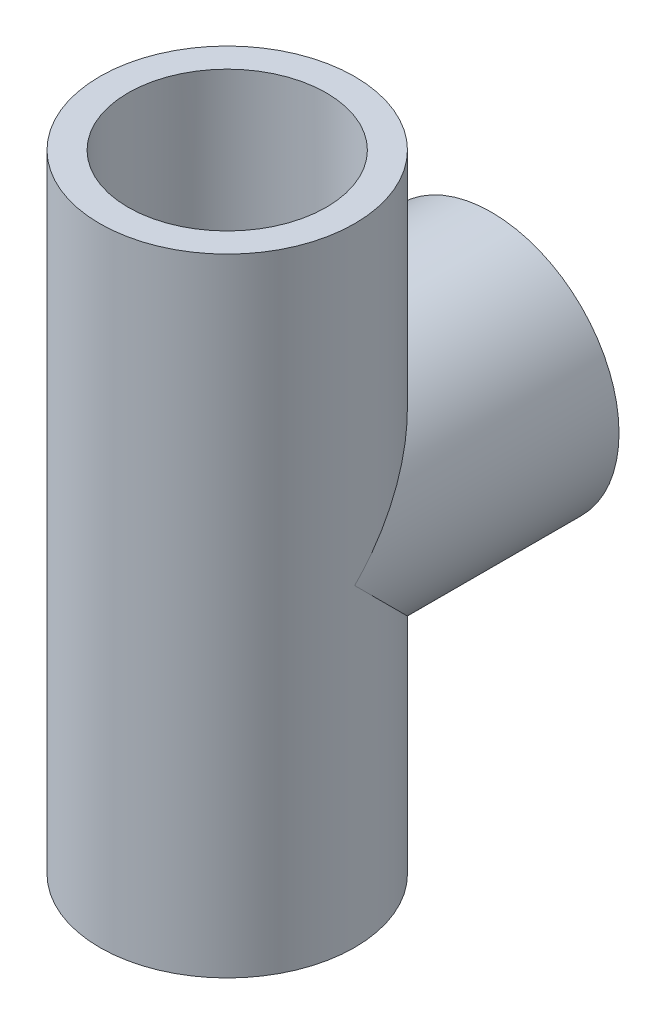
ISO-10303-21;
HEADER;
FILE_DESCRIPTION(('STEP AP214'),'2;1');
FILE_NAME('part.step','',(''),(''),'','','');
FILE_SCHEMA(('AUTOMOTIVE_DESIGN { 1 0 10303 214 1 1 1 1 }'));
ENDSEC;
DATA;
#1=APPLICATION_CONTEXT('core data for automotive mechanical design processes');
#2=APPLICATION_PROTOCOL_DEFINITION('international standard','automotive_design',2000,#1);
#3=PRODUCT_CONTEXT('',#1,'mechanical');
#4=PRODUCT('Part','Part','',(#3));
#5=PRODUCT_RELATED_PRODUCT_CATEGORY('part','',(#4));
#6=PRODUCT_DEFINITION_FORMATION('','',#4);
#7=PRODUCT_DEFINITION_CONTEXT('part definition',#1,'design');
#8=PRODUCT_DEFINITION('design','',#6,#7);
#9=PRODUCT_DEFINITION_SHAPE('','',#8);
#10=(LENGTH_UNIT() NAMED_UNIT(*) SI_UNIT(.MILLI.,.METRE.));
#11=(NAMED_UNIT(*) PLANE_ANGLE_UNIT() SI_UNIT($,.RADIAN.));
#12=(NAMED_UNIT(*) SI_UNIT($,.STERADIAN.) SOLID_ANGLE_UNIT());
#13=UNCERTAINTY_MEASURE_WITH_UNIT(LENGTH_MEASURE(1.E-05),#10,'distance_accuracy_value','');
#14=(GEOMETRIC_REPRESENTATION_CONTEXT(3) GLOBAL_UNCERTAINTY_ASSIGNED_CONTEXT((#13)) GLOBAL_UNIT_ASSIGNED_CONTEXT((#10,
#11,#12)) REPRESENTATION_CONTEXT('',''));
#15=CARTESIAN_POINT('',(0.,0.,0.));
#16=DIRECTION('',(0.,0.,1.));
#17=DIRECTION('',(1.,0.,0.));
#18=AXIS2_PLACEMENT_3D('',#15,#16,#17);
#19=CARTESIAN_POINT('',(0.,84.328,0.));
#20=DIRECTION('',(0.,1.,0.));
#21=DIRECTION('',(0.,0.,1.));
#22=AXIS2_PLACEMENT_3D('',#19,#20,#21);
#23=PLANE('',#22);
#24=CARTESIAN_POINT('',(0.,84.328,0.));
#25=DIRECTION('',(0.,1.,0.));
#26=DIRECTION('',(0.,0.,1.));
#27=AXIS2_PLACEMENT_3D('',#24,#25,#26);
#28=CIRCLE('',#27,17.145);
#29=CARTESIAN_POINT('',(0.,84.328,17.145));
#30=VERTEX_POINT('',#29);
#31=EDGE_CURVE('E11',#30,#30,#28,.T.);
#32=ORIENTED_EDGE('',*,*,#31,.T.);
#33=EDGE_LOOP('',(#32));
#34=FACE_BOUND('',#33,.T.);
#35=CARTESIAN_POINT('',(0.,84.328,0.));
#36=DIRECTION('',(0.,1.,0.));
#37=DIRECTION('',(0.,0.,1.));
#38=AXIS2_PLACEMENT_3D('',#35,#36,#37);
#39=CIRCLE('',#38,13.335);
#40=CARTESIAN_POINT('',(0.,84.328,13.335));
#41=VERTEX_POINT('',#40);
#42=EDGE_CURVE('E80',#41,#41,#39,.T.);
#43=ORIENTED_EDGE('',*,*,#42,.F.);
#44=EDGE_LOOP('',(#43));
#45=FACE_BOUND('',#44,.T.);
#46=ADVANCED_FACE('F36',(#34,#45),#23,.T.);
#47=CARTESIAN_POINT('',(0.,0.,0.));
#48=DIRECTION('',(0.,1.,0.));
#49=DIRECTION('',(0.,0.,1.));
#50=AXIS2_PLACEMENT_3D('',#47,#48,#49);
#51=PLANE('',#50);
#52=CARTESIAN_POINT('',(0.,0.,0.));
#53=DIRECTION('',(0.,1.,0.));
#54=DIRECTION('',(0.,0.,1.));
#55=AXIS2_PLACEMENT_3D('',#52,#53,#54);
#56=CIRCLE('',#55,17.145);
#57=CARTESIAN_POINT('',(0.,0.,17.145));
#58=VERTEX_POINT('',#57);
#59=EDGE_CURVE('E40',#58,#58,#56,.T.);
#60=ORIENTED_EDGE('',*,*,#59,.F.);
#61=EDGE_LOOP('',(#60));
#62=FACE_BOUND('',#61,.T.);
#63=CARTESIAN_POINT('',(0.,0.,0.));
#64=DIRECTION('',(0.,1.,0.));
#65=DIRECTION('',(0.,0.,1.));
#66=AXIS2_PLACEMENT_3D('',#63,#64,#65);
#67=CIRCLE('',#66,13.335);
#68=CARTESIAN_POINT('',(0.,0.,13.335));
#69=VERTEX_POINT('',#68);
#70=EDGE_CURVE('E79',#69,#69,#67,.T.);
#71=ORIENTED_EDGE('',*,*,#70,.T.);
#72=EDGE_LOOP('',(#71));
#73=FACE_BOUND('',#72,.T.);
#74=ADVANCED_FACE('F86',(#62,#73),#51,.F.);
#75=CARTESIAN_POINT('',(0.,84.328,0.));
#76=DIRECTION('',(0.,-1.,0.));
#77=DIRECTION('',(0.,0.,-1.));
#78=AXIS2_PLACEMENT_3D('',#75,#76,#77);
#79=CYLINDRICAL_SURFACE('',#78,17.145);
#80=CARTESIAN_POINT('',(0.,42.164,0.));
#81=DIRECTION('',(0.,-0.707106781186547,-0.707106781186547));
#82=DIRECTION('',(0.,-0.707106781186547,0.707106781186547));
#83=AXIS2_PLACEMENT_3D('',#80,#81,#82);
#84=ELLIPSE('',#83,24.2466915268867,17.145);
#85=CARTESIAN_POINT('',(17.145,42.164,0.));
#86=VERTEX_POINT('',#85);
#87=CARTESIAN_POINT('',(-17.145,42.164,0.));
#88=VERTEX_POINT('',#87);
#89=EDGE_CURVE('E76',#86,#88,#84,.F.);
#90=ORIENTED_EDGE('',*,*,#89,.T.);
#91=CARTESIAN_POINT('',(0.,42.164,0.));
#92=DIRECTION('',(0.,-0.707106781186547,0.707106781186547));
#93=DIRECTION('',(0.,-0.707106781186547,-0.707106781186547));
#94=AXIS2_PLACEMENT_3D('',#91,#92,#93);
#95=ELLIPSE('',#94,24.2466915268867,17.145);
#96=EDGE_CURVE('E57',#88,#86,#95,.T.);
#97=ORIENTED_EDGE('',*,*,#96,.T.);
#98=EDGE_LOOP('',(#90,#97));
#99=FACE_BOUND('',#98,.T.);
#100=ORIENTED_EDGE('',*,*,#31,.F.);
#101=EDGE_LOOP('',(#100));
#102=FACE_BOUND('',#101,.T.);
#103=ORIENTED_EDGE('',*,*,#59,.T.);
#104=EDGE_LOOP('',(#103));
#105=FACE_BOUND('',#104,.T.);
#106=ADVANCED_FACE('F38',(#99,#102,#105),#79,.T.);
#107=CARTESIAN_POINT('',(0.,84.328,0.));
#108=DIRECTION('',(0.,-1.,0.));
#109=DIRECTION('',(0.,0.,-1.));
#110=AXIS2_PLACEMENT_3D('',#107,#108,#109);
#111=CYLINDRICAL_SURFACE('',#110,13.335);
#112=CARTESIAN_POINT('',(0.,42.164,0.));
#113=DIRECTION('',(0.,-0.707106781186548,-0.707106781186547));
#114=DIRECTION('',(0.,-0.707106781186548,0.707106781186547));
#115=AXIS2_PLACEMENT_3D('',#112,#113,#114);
#116=ELLIPSE('',#115,18.8585378542452,13.335);
#117=CARTESIAN_POINT('',(13.335,42.164,0.));
#118=VERTEX_POINT('',#117);
#119=CARTESIAN_POINT('',(-13.335,42.164,0.));
#120=VERTEX_POINT('',#119);
#121=EDGE_CURVE('E50',#118,#120,#116,.F.);
#122=ORIENTED_EDGE('',*,*,#121,.F.);
#123=CARTESIAN_POINT('',(0.,42.164,0.));
#124=DIRECTION('',(0.,-0.707106781186548,0.707106781186547));
#125=DIRECTION('',(0.,-0.707106781186548,-0.707106781186547));
#126=AXIS2_PLACEMENT_3D('',#123,#124,#125);
#127=ELLIPSE('',#126,18.8585378542452,13.335);
#128=EDGE_CURVE('E62',#120,#118,#127,.T.);
#129=ORIENTED_EDGE('',*,*,#128,.F.);
#130=EDGE_LOOP('',(#122,#129));
#131=FACE_BOUND('',#130,.T.);
#132=ORIENTED_EDGE('',*,*,#42,.T.);
#133=EDGE_LOOP('',(#132));
#134=FACE_BOUND('',#133,.T.);
#135=ORIENTED_EDGE('',*,*,#70,.F.);
#136=EDGE_LOOP('',(#135));
#137=FACE_BOUND('',#136,.T.);
#138=ADVANCED_FACE('F66',(#131,#134,#137),#111,.F.);
#139=CARTESIAN_POINT('',(0.,42.164,-35.56));
#140=DIRECTION('',(0.,0.,1.));
#141=DIRECTION('',(1.,0.,0.));
#142=AXIS2_PLACEMENT_3D('',#139,#140,#141);
#143=CYLINDRICAL_SURFACE('',#142,17.145);
#144=CARTESIAN_POINT('',(0.,42.164,-35.56));
#145=DIRECTION('',(0.,0.,1.));
#146=DIRECTION('',(1.,0.,0.));
#147=AXIS2_PLACEMENT_3D('',#144,#145,#146);
#148=CIRCLE('',#147,17.145);
#149=CARTESIAN_POINT('',(17.145,42.164,-35.56));
#150=VERTEX_POINT('',#149);
#151=EDGE_CURVE('E71',#150,#150,#148,.T.);
#152=ORIENTED_EDGE('',*,*,#151,.T.);
#153=EDGE_LOOP('',(#152));
#154=FACE_BOUND('',#153,.T.);
#155=ORIENTED_EDGE('',*,*,#96,.F.);
#156=ORIENTED_EDGE('',*,*,#89,.F.);
#157=EDGE_LOOP('',(#155,#156));
#158=FACE_BOUND('',#157,.T.);
#159=ADVANCED_FACE('F89',(#154,#158),#143,.T.);
#160=CARTESIAN_POINT('',(0.,42.164,-35.56));
#161=DIRECTION('',(0.,0.,1.));
#162=DIRECTION('',(1.,0.,0.));
#163=AXIS2_PLACEMENT_3D('',#160,#161,#162);
#164=CYLINDRICAL_SURFACE('',#163,13.335);
#165=CARTESIAN_POINT('',(0.,42.164,-35.56));
#166=DIRECTION('',(0.,0.,1.));
#167=DIRECTION('',(1.,0.,0.));
#168=AXIS2_PLACEMENT_3D('',#165,#166,#167);
#169=CIRCLE('',#168,13.335);
#170=CARTESIAN_POINT('',(13.335,42.164,-35.56));
#171=VERTEX_POINT('',#170);
#172=EDGE_CURVE('E68',#171,#171,#169,.T.);
#173=ORIENTED_EDGE('',*,*,#172,.F.);
#174=EDGE_LOOP('',(#173));
#175=FACE_BOUND('',#174,.T.);
#176=ORIENTED_EDGE('',*,*,#121,.T.);
#177=ORIENTED_EDGE('',*,*,#128,.T.);
#178=EDGE_LOOP('',(#176,#177));
#179=FACE_BOUND('',#178,.T.);
#180=ADVANCED_FACE('F63',(#175,#179),#164,.F.);
#181=CARTESIAN_POINT('',(0.,42.164,-35.56));
#182=DIRECTION('',(0.,0.,1.));
#183=DIRECTION('',(1.,0.,0.));
#184=AXIS2_PLACEMENT_3D('',#181,#182,#183);
#185=PLANE('',#184);
#186=ORIENTED_EDGE('',*,*,#172,.T.);
#187=EDGE_LOOP('',(#186));
#188=FACE_BOUND('',#187,.T.);
#189=ORIENTED_EDGE('',*,*,#151,.F.);
#190=EDGE_LOOP('',(#189));
#191=FACE_BOUND('',#190,.T.);
#192=ADVANCED_FACE('F130',(#188,#191),#185,.F.);
#193=CLOSED_SHELL('',(#46,#74,#106,#138,#159,#180,#192));
#194=MANIFOLD_SOLID_BREP('B2',#193);
#195=ADVANCED_BREP_SHAPE_REPRESENTATION('',(#18,#194),#14);
#196=SHAPE_DEFINITION_REPRESENTATION(#9,#195);
ENDSEC;
END-ISO-10303-21;
